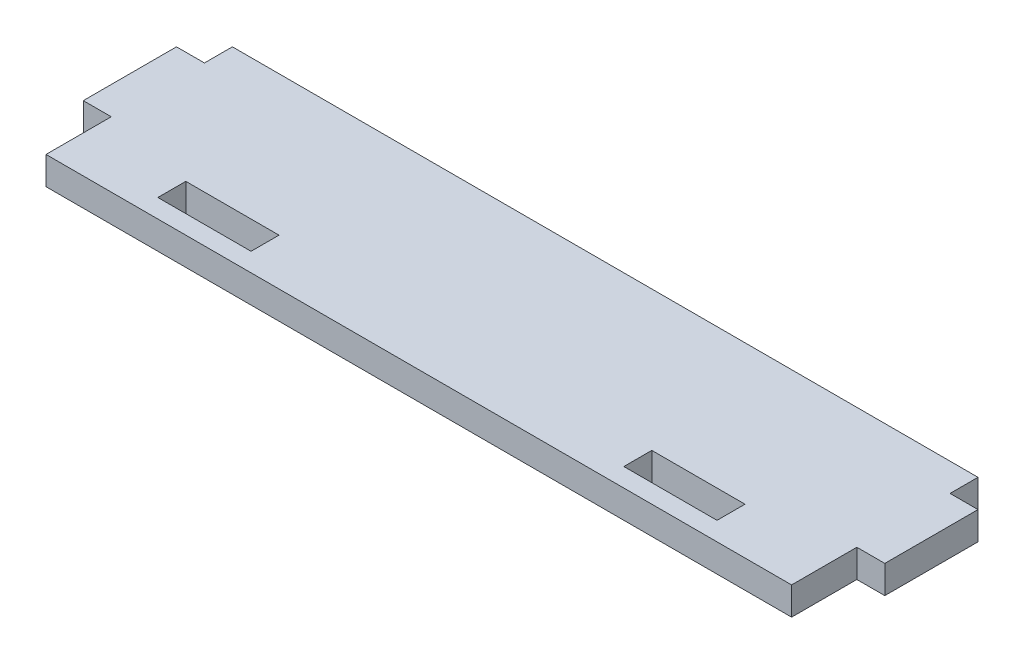
ISO-10303-21;
HEADER;
FILE_DESCRIPTION(('STEP AP214'),'2;1');
FILE_NAME('part.step','',(''),(''),'','','');
FILE_SCHEMA(('AUTOMOTIVE_DESIGN { 1 0 10303 214 1 1 1 1 }'));
ENDSEC;
DATA;
#1=APPLICATION_CONTEXT('core data for automotive mechanical design processes');
#2=APPLICATION_PROTOCOL_DEFINITION('international standard','automotive_design',2000,#1);
#3=PRODUCT_CONTEXT('',#1,'mechanical');
#4=PRODUCT('Part','Part','',(#3));
#5=PRODUCT_RELATED_PRODUCT_CATEGORY('part','',(#4));
#6=PRODUCT_DEFINITION_FORMATION('','',#4);
#7=PRODUCT_DEFINITION_CONTEXT('part definition',#1,'design');
#8=PRODUCT_DEFINITION('design','',#6,#7);
#9=PRODUCT_DEFINITION_SHAPE('','',#8);
#10=(LENGTH_UNIT() NAMED_UNIT(*) SI_UNIT(.MILLI.,.METRE.));
#11=(NAMED_UNIT(*) PLANE_ANGLE_UNIT() SI_UNIT($,.RADIAN.));
#12=(NAMED_UNIT(*) SI_UNIT($,.STERADIAN.) SOLID_ANGLE_UNIT());
#13=UNCERTAINTY_MEASURE_WITH_UNIT(LENGTH_MEASURE(1.E-05),#10,'distance_accuracy_value','');
#14=(GEOMETRIC_REPRESENTATION_CONTEXT(3) GLOBAL_UNCERTAINTY_ASSIGNED_CONTEXT((#13)) GLOBAL_UNIT_ASSIGNED_CONTEXT((#10,
#11,#12)) REPRESENTATION_CONTEXT('',''));
#15=CARTESIAN_POINT('',(0.,0.,0.));
#16=DIRECTION('',(0.,0.,1.));
#17=DIRECTION('',(1.,0.,0.));
#18=AXIS2_PLACEMENT_3D('',#15,#16,#17);
#19=CARTESIAN_POINT('',(0.,3.,0.));
#20=DIRECTION('',(0.,1.,0.));
#21=DIRECTION('',(0.,0.,1.));
#22=AXIS2_PLACEMENT_3D('',#19,#20,#21);
#23=PLANE('',#22);
#24=DIRECTION('',(0.,0.,1.));
#25=VECTOR('',#24,1.);
#26=CARTESIAN_POINT('',(0.,3.,0.));
#27=LINE('',#26,#25);
#28=CARTESIAN_POINT('',(0.,3.,-7.));
#29=VERTEX_POINT('',#28);
#30=CARTESIAN_POINT('',(0.,3.,0.));
#31=VERTEX_POINT('',#30);
#32=EDGE_CURVE('E237',#29,#31,#27,.T.);
#33=ORIENTED_EDGE('',*,*,#32,.T.);
#34=DIRECTION('',(1.,0.,0.));
#35=VECTOR('',#34,1.);
#36=CARTESIAN_POINT('',(0.,3.,0.));
#37=LINE('',#36,#35);
#38=CARTESIAN_POINT('',(80.,3.,0.));
#39=VERTEX_POINT('',#38);
#40=EDGE_CURVE('E240',#31,#39,#37,.T.);
#41=ORIENTED_EDGE('',*,*,#40,.T.);
#42=DIRECTION('',(0.,0.,-1.));
#43=VECTOR('',#42,1.);
#44=CARTESIAN_POINT('',(80.,3.,0.));
#45=LINE('',#44,#43);
#46=CARTESIAN_POINT('',(80.,3.,-7.));
#47=VERTEX_POINT('',#46);
#48=EDGE_CURVE('E243',#39,#47,#45,.T.);
#49=ORIENTED_EDGE('',*,*,#48,.T.);
#50=DIRECTION('',(1.,0.,0.));
#51=VECTOR('',#50,1.);
#52=CARTESIAN_POINT('',(80.,3.,-7.));
#53=LINE('',#52,#51);
#54=CARTESIAN_POINT('',(83.,3.,-7.));
#55=VERTEX_POINT('',#54);
#56=EDGE_CURVE('E245',#47,#55,#53,.T.);
#57=ORIENTED_EDGE('',*,*,#56,.T.);
#58=DIRECTION('',(0.,0.,-1.));
#59=VECTOR('',#58,1.);
#60=CARTESIAN_POINT('',(83.,3.,-17.));
#61=LINE('',#60,#59);
#62=CARTESIAN_POINT('',(83.,3.,-17.));
#63=VERTEX_POINT('',#62);
#64=EDGE_CURVE('E247',#55,#63,#61,.T.);
#65=ORIENTED_EDGE('',*,*,#64,.T.);
#66=DIRECTION('',(-1.,0.,0.));
#67=VECTOR('',#66,1.);
#68=CARTESIAN_POINT('',(80.,3.,-17.));
#69=LINE('',#68,#67);
#70=CARTESIAN_POINT('',(80.,3.,-17.));
#71=VERTEX_POINT('',#70);
#72=EDGE_CURVE('E249',#63,#71,#69,.T.);
#73=ORIENTED_EDGE('',*,*,#72,.T.);
#74=DIRECTION('',(0.,0.,-1.));
#75=VECTOR('',#74,1.);
#76=CARTESIAN_POINT('',(80.,3.,-17.));
#77=LINE('',#76,#75);
#78=CARTESIAN_POINT('',(80.,3.,-20.));
#79=VERTEX_POINT('',#78);
#80=EDGE_CURVE('E251',#71,#79,#77,.T.);
#81=ORIENTED_EDGE('',*,*,#80,.T.);
#82=DIRECTION('',(-1.,0.,0.));
#83=VECTOR('',#82,1.);
#84=CARTESIAN_POINT('',(0.,3.,-20.));
#85=LINE('',#84,#83);
#86=CARTESIAN_POINT('',(0.,3.,-20.));
#87=VERTEX_POINT('',#86);
#88=EDGE_CURVE('E253',#79,#87,#85,.T.);
#89=ORIENTED_EDGE('',*,*,#88,.T.);
#90=DIRECTION('',(0.,0.,1.));
#91=VECTOR('',#90,1.);
#92=CARTESIAN_POINT('',(0.,3.,-17.));
#93=LINE('',#92,#91);
#94=CARTESIAN_POINT('',(0.,3.,-17.));
#95=VERTEX_POINT('',#94);
#96=EDGE_CURVE('E255',#87,#95,#93,.T.);
#97=ORIENTED_EDGE('',*,*,#96,.T.);
#98=DIRECTION('',(-1.,0.,0.));
#99=VECTOR('',#98,1.);
#100=CARTESIAN_POINT('',(0.,3.,-17.));
#101=LINE('',#100,#99);
#102=CARTESIAN_POINT('',(-3.,3.,-17.));
#103=VERTEX_POINT('',#102);
#104=EDGE_CURVE('E257',#95,#103,#101,.T.);
#105=ORIENTED_EDGE('',*,*,#104,.T.);
#106=DIRECTION('',(0.,0.,1.));
#107=VECTOR('',#106,1.);
#108=CARTESIAN_POINT('',(-3.,3.,-17.));
#109=LINE('',#108,#107);
#110=CARTESIAN_POINT('',(-3.,3.,-7.));
#111=VERTEX_POINT('',#110);
#112=EDGE_CURVE('E259',#103,#111,#109,.T.);
#113=ORIENTED_EDGE('',*,*,#112,.T.);
#114=DIRECTION('',(1.,0.,0.));
#115=VECTOR('',#114,1.);
#116=CARTESIAN_POINT('',(0.,3.,-7.));
#117=LINE('',#116,#115);
#118=EDGE_CURVE('E261',#111,#29,#117,.T.);
#119=ORIENTED_EDGE('',*,*,#118,.T.);
#120=EDGE_LOOP('',(#33,#41,#49,#57,#65,#73,#81,#89,#97,#105,#113,#119));
#121=FACE_BOUND('',#120,.T.);
#122=DIRECTION('',(1.,0.,0.));
#123=VECTOR('',#122,1.);
#124=CARTESIAN_POINT('',(10.,3.,-2.));
#125=LINE('',#124,#123);
#126=CARTESIAN_POINT('',(10.,3.,-2.));
#127=VERTEX_POINT('',#126);
#128=CARTESIAN_POINT('',(20.,3.,-2.));
#129=VERTEX_POINT('',#128);
#130=EDGE_CURVE('E208',#127,#129,#125,.T.);
#131=ORIENTED_EDGE('',*,*,#130,.F.);
#132=DIRECTION('',(0.,0.,1.));
#133=VECTOR('',#132,1.);
#134=CARTESIAN_POINT('',(10.,3.,-5.));
#135=LINE('',#134,#133);
#136=CARTESIAN_POINT('',(10.,3.,-5.));
#137=VERTEX_POINT('',#136);
#138=EDGE_CURVE('E206',#137,#127,#135,.T.);
#139=ORIENTED_EDGE('',*,*,#138,.F.);
#140=DIRECTION('',(-1.,0.,0.));
#141=VECTOR('',#140,1.);
#142=CARTESIAN_POINT('',(10.,3.,-5.));
#143=LINE('',#142,#141);
#144=CARTESIAN_POINT('',(20.,3.,-5.));
#145=VERTEX_POINT('',#144);
#146=EDGE_CURVE('E214',#145,#137,#143,.T.);
#147=ORIENTED_EDGE('',*,*,#146,.F.);
#148=DIRECTION('',(0.,0.,-1.));
#149=VECTOR('',#148,1.);
#150=CARTESIAN_POINT('',(20.,3.,-5.));
#151=LINE('',#150,#149);
#152=EDGE_CURVE('E211',#129,#145,#151,.T.);
#153=ORIENTED_EDGE('',*,*,#152,.F.);
#154=EDGE_LOOP('',(#131,#139,#147,#153));
#155=FACE_BOUND('',#154,.T.);
#156=DIRECTION('',(1.,0.,0.));
#157=VECTOR('',#156,1.);
#158=CARTESIAN_POINT('',(60.,3.,-2.00000000000001));
#159=LINE('',#158,#157);
#160=CARTESIAN_POINT('',(60.,3.,-2.00000000000001));
#161=VERTEX_POINT('',#160);
#162=CARTESIAN_POINT('',(70.,3.,-2.00000000000001));
#163=VERTEX_POINT('',#162);
#164=EDGE_CURVE('E178',#161,#163,#159,.T.);
#165=ORIENTED_EDGE('',*,*,#164,.F.);
#166=DIRECTION('',(0.,0.,1.));
#167=VECTOR('',#166,1.);
#168=CARTESIAN_POINT('',(60.,3.,-5.00000000000001));
#169=LINE('',#168,#167);
#170=CARTESIAN_POINT('',(60.,3.,-5.00000000000001));
#171=VERTEX_POINT('',#170);
#172=EDGE_CURVE('E170',#171,#161,#169,.T.);
#173=ORIENTED_EDGE('',*,*,#172,.F.);
#174=DIRECTION('',(-1.,0.,0.));
#175=VECTOR('',#174,1.);
#176=CARTESIAN_POINT('',(60.,3.,-5.00000000000001));
#177=LINE('',#176,#175);
#178=CARTESIAN_POINT('',(70.,3.,-5.00000000000001));
#179=VERTEX_POINT('',#178);
#180=EDGE_CURVE('E192',#179,#171,#177,.T.);
#181=ORIENTED_EDGE('',*,*,#180,.F.);
#182=DIRECTION('',(0.,0.,-1.));
#183=VECTOR('',#182,1.);
#184=CARTESIAN_POINT('',(70.,3.,-5.00000000000001));
#185=LINE('',#184,#183);
#186=EDGE_CURVE('E190',#163,#179,#185,.T.);
#187=ORIENTED_EDGE('',*,*,#186,.F.);
#188=EDGE_LOOP('',(#165,#173,#181,#187));
#189=FACE_BOUND('',#188,.T.);
#190=ADVANCED_FACE('F33',(#121,#155,#189),#23,.T.);
#191=CARTESIAN_POINT('',(0.,0.,0.));
#192=DIRECTION('',(0.,1.,0.));
#193=DIRECTION('',(0.,0.,1.));
#194=AXIS2_PLACEMENT_3D('',#191,#192,#193);
#195=PLANE('',#194);
#196=DIRECTION('',(0.,0.,1.));
#197=VECTOR('',#196,1.);
#198=CARTESIAN_POINT('',(10.,0.,-5.));
#199=LINE('',#198,#197);
#200=CARTESIAN_POINT('',(10.,0.,-5.));
#201=VERTEX_POINT('',#200);
#202=CARTESIAN_POINT('',(10.,0.,-2.));
#203=VERTEX_POINT('',#202);
#204=EDGE_CURVE('E186',#201,#203,#199,.T.);
#205=ORIENTED_EDGE('',*,*,#204,.T.);
#206=DIRECTION('',(1.,0.,0.));
#207=VECTOR('',#206,1.);
#208=CARTESIAN_POINT('',(10.,0.,-2.));
#209=LINE('',#208,#207);
#210=CARTESIAN_POINT('',(20.,0.,-2.));
#211=VERTEX_POINT('',#210);
#212=EDGE_CURVE('E219',#203,#211,#209,.T.);
#213=ORIENTED_EDGE('',*,*,#212,.T.);
#214=DIRECTION('',(0.,0.,-1.));
#215=VECTOR('',#214,1.);
#216=CARTESIAN_POINT('',(20.,0.,-5.));
#217=LINE('',#216,#215);
#218=CARTESIAN_POINT('',(20.,0.,-5.));
#219=VERTEX_POINT('',#218);
#220=EDGE_CURVE('E222',#211,#219,#217,.T.);
#221=ORIENTED_EDGE('',*,*,#220,.T.);
#222=DIRECTION('',(-1.,0.,0.));
#223=VECTOR('',#222,1.);
#224=CARTESIAN_POINT('',(10.,0.,-5.));
#225=LINE('',#224,#223);
#226=EDGE_CURVE('E209',#219,#201,#225,.T.);
#227=ORIENTED_EDGE('',*,*,#226,.T.);
#228=EDGE_LOOP('',(#205,#213,#221,#227));
#229=FACE_BOUND('',#228,.T.);
#230=DIRECTION('',(0.,0.,1.));
#231=VECTOR('',#230,1.);
#232=CARTESIAN_POINT('',(0.,0.,0.));
#233=LINE('',#232,#231);
#234=CARTESIAN_POINT('',(0.,0.,-7.));
#235=VERTEX_POINT('',#234);
#236=CARTESIAN_POINT('',(0.,0.,0.));
#237=VERTEX_POINT('',#236);
#238=EDGE_CURVE('E236',#235,#237,#233,.T.);
#239=ORIENTED_EDGE('',*,*,#238,.F.);
#240=DIRECTION('',(1.,0.,0.));
#241=VECTOR('',#240,1.);
#242=CARTESIAN_POINT('',(0.,0.,-7.));
#243=LINE('',#242,#241);
#244=CARTESIAN_POINT('',(-3.,0.,-7.));
#245=VERTEX_POINT('',#244);
#246=EDGE_CURVE('E241',#245,#235,#243,.T.);
#247=ORIENTED_EDGE('',*,*,#246,.F.);
#248=DIRECTION('',(0.,0.,1.));
#249=VECTOR('',#248,1.);
#250=CARTESIAN_POINT('',(-3.,0.,-17.));
#251=LINE('',#250,#249);
#252=CARTESIAN_POINT('',(-3.,0.,-17.));
#253=VERTEX_POINT('',#252);
#254=EDGE_CURVE('E284',#253,#245,#251,.T.);
#255=ORIENTED_EDGE('',*,*,#254,.F.);
#256=DIRECTION('',(-1.,0.,0.));
#257=VECTOR('',#256,1.);
#258=CARTESIAN_POINT('',(0.,0.,-17.));
#259=LINE('',#258,#257);
#260=CARTESIAN_POINT('',(0.,0.,-17.));
#261=VERTEX_POINT('',#260);
#262=EDGE_CURVE('E282',#261,#253,#259,.T.);
#263=ORIENTED_EDGE('',*,*,#262,.F.);
#264=DIRECTION('',(0.,0.,1.));
#265=VECTOR('',#264,1.);
#266=CARTESIAN_POINT('',(0.,0.,-17.));
#267=LINE('',#266,#265);
#268=CARTESIAN_POINT('',(0.,0.,-20.));
#269=VERTEX_POINT('',#268);
#270=EDGE_CURVE('E280',#269,#261,#267,.T.);
#271=ORIENTED_EDGE('',*,*,#270,.F.);
#272=DIRECTION('',(-1.,0.,0.));
#273=VECTOR('',#272,1.);
#274=CARTESIAN_POINT('',(0.,0.,-20.));
#275=LINE('',#274,#273);
#276=CARTESIAN_POINT('',(80.,0.,-20.));
#277=VERTEX_POINT('',#276);
#278=EDGE_CURVE('E278',#277,#269,#275,.T.);
#279=ORIENTED_EDGE('',*,*,#278,.F.);
#280=DIRECTION('',(0.,0.,-1.));
#281=VECTOR('',#280,1.);
#282=CARTESIAN_POINT('',(80.,0.,-17.));
#283=LINE('',#282,#281);
#284=CARTESIAN_POINT('',(80.,0.,-17.));
#285=VERTEX_POINT('',#284);
#286=EDGE_CURVE('E276',#285,#277,#283,.T.);
#287=ORIENTED_EDGE('',*,*,#286,.F.);
#288=DIRECTION('',(-1.,0.,0.));
#289=VECTOR('',#288,1.);
#290=CARTESIAN_POINT('',(80.,0.,-17.));
#291=LINE('',#290,#289);
#292=CARTESIAN_POINT('',(83.,0.,-17.));
#293=VERTEX_POINT('',#292);
#294=EDGE_CURVE('E274',#293,#285,#291,.T.);
#295=ORIENTED_EDGE('',*,*,#294,.F.);
#296=DIRECTION('',(0.,0.,-1.));
#297=VECTOR('',#296,1.);
#298=CARTESIAN_POINT('',(83.,0.,-17.));
#299=LINE('',#298,#297);
#300=CARTESIAN_POINT('',(83.,0.,-7.));
#301=VERTEX_POINT('',#300);
#302=EDGE_CURVE('E272',#301,#293,#299,.T.);
#303=ORIENTED_EDGE('',*,*,#302,.F.);
#304=DIRECTION('',(1.,0.,0.));
#305=VECTOR('',#304,1.);
#306=CARTESIAN_POINT('',(80.,0.,-7.));
#307=LINE('',#306,#305);
#308=CARTESIAN_POINT('',(80.,0.,-7.));
#309=VERTEX_POINT('',#308);
#310=EDGE_CURVE('E270',#309,#301,#307,.T.);
#311=ORIENTED_EDGE('',*,*,#310,.F.);
#312=DIRECTION('',(0.,0.,-1.));
#313=VECTOR('',#312,1.);
#314=CARTESIAN_POINT('',(80.,0.,0.));
#315=LINE('',#314,#313);
#316=CARTESIAN_POINT('',(80.,0.,0.));
#317=VERTEX_POINT('',#316);
#318=EDGE_CURVE('E268',#317,#309,#315,.T.);
#319=ORIENTED_EDGE('',*,*,#318,.F.);
#320=DIRECTION('',(1.,0.,0.));
#321=VECTOR('',#320,1.);
#322=CARTESIAN_POINT('',(0.,0.,0.));
#323=LINE('',#322,#321);
#324=EDGE_CURVE('E266',#237,#317,#323,.T.);
#325=ORIENTED_EDGE('',*,*,#324,.F.);
#326=EDGE_LOOP('',(#239,#247,#255,#263,#271,#279,#287,#295,#303,#311,#319,#325));
#327=FACE_BOUND('',#326,.T.);
#328=DIRECTION('',(0.,0.,1.));
#329=VECTOR('',#328,1.);
#330=CARTESIAN_POINT('',(60.,0.,-5.00000000000001));
#331=LINE('',#330,#329);
#332=CARTESIAN_POINT('',(60.,0.,-5.00000000000001));
#333=VERTEX_POINT('',#332);
#334=CARTESIAN_POINT('',(60.,0.,-2.00000000000001));
#335=VERTEX_POINT('',#334);
#336=EDGE_CURVE('E56',#333,#335,#331,.T.);
#337=ORIENTED_EDGE('',*,*,#336,.T.);
#338=DIRECTION('',(1.,0.,0.));
#339=VECTOR('',#338,1.);
#340=CARTESIAN_POINT('',(60.,0.,-2.00000000000001));
#341=LINE('',#340,#339);
#342=CARTESIAN_POINT('',(70.,0.,-2.00000000000001));
#343=VERTEX_POINT('',#342);
#344=EDGE_CURVE('E185',#335,#343,#341,.T.);
#345=ORIENTED_EDGE('',*,*,#344,.T.);
#346=DIRECTION('',(0.,0.,-1.));
#347=VECTOR('',#346,1.);
#348=CARTESIAN_POINT('',(70.,0.,-5.00000000000001));
#349=LINE('',#348,#347);
#350=CARTESIAN_POINT('',(70.,0.,-5.00000000000001));
#351=VERTEX_POINT('',#350);
#352=EDGE_CURVE('E198',#343,#351,#349,.T.);
#353=ORIENTED_EDGE('',*,*,#352,.T.);
#354=DIRECTION('',(-1.,0.,0.));
#355=VECTOR('',#354,1.);
#356=CARTESIAN_POINT('',(60.,0.,-5.00000000000001));
#357=LINE('',#356,#355);
#358=EDGE_CURVE('E179',#351,#333,#357,.T.);
#359=ORIENTED_EDGE('',*,*,#358,.T.);
#360=EDGE_LOOP('',(#337,#345,#353,#359));
#361=FACE_BOUND('',#360,.T.);
#362=ADVANCED_FACE('F326',(#229,#327,#361),#195,.F.);
#363=CARTESIAN_POINT('',(0.,3.,0.));
#364=DIRECTION('',(1.,0.,0.));
#365=DIRECTION('',(0.,0.,-1.));
#366=AXIS2_PLACEMENT_3D('',#363,#364,#365);
#367=PLANE('',#366);
#368=ORIENTED_EDGE('',*,*,#238,.T.);
#369=DIRECTION('',(0.,-1.,0.));
#370=VECTOR('',#369,1.);
#371=CARTESIAN_POINT('',(0.,3.,0.));
#372=LINE('',#371,#370);
#373=EDGE_CURVE('E11',#31,#237,#372,.T.);
#374=ORIENTED_EDGE('',*,*,#373,.F.);
#375=ORIENTED_EDGE('',*,*,#32,.F.);
#376=DIRECTION('',(0.,-1.,0.));
#377=VECTOR('',#376,1.);
#378=CARTESIAN_POINT('',(0.,3.,-7.));
#379=LINE('',#378,#377);
#380=EDGE_CURVE('E263',#29,#235,#379,.T.);
#381=ORIENTED_EDGE('',*,*,#380,.T.);
#382=EDGE_LOOP('',(#368,#374,#375,#381));
#383=FACE_BOUND('',#382,.T.);
#384=ADVANCED_FACE('F35',(#383),#367,.F.);
#385=CARTESIAN_POINT('',(0.,3.,0.));
#386=DIRECTION('',(0.,0.,-1.));
#387=DIRECTION('',(-1.,0.,0.));
#388=AXIS2_PLACEMENT_3D('',#385,#386,#387);
#389=PLANE('',#388);
#390=ORIENTED_EDGE('',*,*,#324,.T.);
#391=DIRECTION('',(0.,-1.,0.));
#392=VECTOR('',#391,1.);
#393=CARTESIAN_POINT('',(80.,3.,0.));
#394=LINE('',#393,#392);
#395=EDGE_CURVE('E41',#39,#317,#394,.T.);
#396=ORIENTED_EDGE('',*,*,#395,.F.);
#397=ORIENTED_EDGE('',*,*,#40,.F.);
#398=ORIENTED_EDGE('',*,*,#373,.T.);
#399=EDGE_LOOP('',(#390,#396,#397,#398));
#400=FACE_BOUND('',#399,.T.);
#401=ADVANCED_FACE('F344',(#400),#389,.F.);
#402=CARTESIAN_POINT('',(80.,3.,0.));
#403=DIRECTION('',(-1.,0.,0.));
#404=DIRECTION('',(0.,0.,1.));
#405=AXIS2_PLACEMENT_3D('',#402,#403,#404);
#406=PLANE('',#405);
#407=ORIENTED_EDGE('',*,*,#318,.T.);
#408=DIRECTION('',(0.,-1.,0.));
#409=VECTOR('',#408,1.);
#410=CARTESIAN_POINT('',(80.,3.,-7.));
#411=LINE('',#410,#409);
#412=EDGE_CURVE('E313',#47,#309,#411,.T.);
#413=ORIENTED_EDGE('',*,*,#412,.F.);
#414=ORIENTED_EDGE('',*,*,#48,.F.);
#415=ORIENTED_EDGE('',*,*,#395,.T.);
#416=EDGE_LOOP('',(#407,#413,#414,#415));
#417=FACE_BOUND('',#416,.T.);
#418=ADVANCED_FACE('F320',(#417),#406,.F.);
#419=CARTESIAN_POINT('',(80.,3.,-7.));
#420=DIRECTION('',(0.,0.,-1.));
#421=DIRECTION('',(-1.,0.,0.));
#422=AXIS2_PLACEMENT_3D('',#419,#420,#421);
#423=PLANE('',#422);
#424=ORIENTED_EDGE('',*,*,#310,.T.);
#425=DIRECTION('',(0.,-1.,0.));
#426=VECTOR('',#425,1.);
#427=CARTESIAN_POINT('',(83.,3.,-7.));
#428=LINE('',#427,#426);
#429=EDGE_CURVE('E310',#55,#301,#428,.T.);
#430=ORIENTED_EDGE('',*,*,#429,.F.);
#431=ORIENTED_EDGE('',*,*,#56,.F.);
#432=ORIENTED_EDGE('',*,*,#412,.T.);
#433=EDGE_LOOP('',(#424,#430,#431,#432));
#434=FACE_BOUND('',#433,.T.);
#435=ADVANCED_FACE('F332',(#434),#423,.F.);
#436=CARTESIAN_POINT('',(83.,3.,-17.));
#437=DIRECTION('',(-1.,0.,0.));
#438=DIRECTION('',(0.,0.,1.));
#439=AXIS2_PLACEMENT_3D('',#436,#437,#438);
#440=PLANE('',#439);
#441=ORIENTED_EDGE('',*,*,#302,.T.);
#442=DIRECTION('',(0.,-1.,0.));
#443=VECTOR('',#442,1.);
#444=CARTESIAN_POINT('',(83.,3.,-17.));
#445=LINE('',#444,#443);
#446=EDGE_CURVE('E307',#63,#293,#445,.T.);
#447=ORIENTED_EDGE('',*,*,#446,.F.);
#448=ORIENTED_EDGE('',*,*,#64,.F.);
#449=ORIENTED_EDGE('',*,*,#429,.T.);
#450=EDGE_LOOP('',(#441,#447,#448,#449));
#451=FACE_BOUND('',#450,.T.);
#452=ADVANCED_FACE('F336',(#451),#440,.F.);
#453=CARTESIAN_POINT('',(80.,3.,-17.));
#454=DIRECTION('',(0.,0.,1.));
#455=DIRECTION('',(1.,0.,0.));
#456=AXIS2_PLACEMENT_3D('',#453,#454,#455);
#457=PLANE('',#456);
#458=ORIENTED_EDGE('',*,*,#294,.T.);
#459=DIRECTION('',(0.,-1.,0.));
#460=VECTOR('',#459,1.);
#461=CARTESIAN_POINT('',(80.,3.,-17.));
#462=LINE('',#461,#460);
#463=EDGE_CURVE('E304',#71,#285,#462,.T.);
#464=ORIENTED_EDGE('',*,*,#463,.F.);
#465=ORIENTED_EDGE('',*,*,#72,.F.);
#466=ORIENTED_EDGE('',*,*,#446,.T.);
#467=EDGE_LOOP('',(#458,#464,#465,#466));
#468=FACE_BOUND('',#467,.T.);
#469=ADVANCED_FACE('F377',(#468),#457,.F.);
#470=CARTESIAN_POINT('',(80.,3.,-17.));
#471=DIRECTION('',(-1.,0.,0.));
#472=DIRECTION('',(0.,0.,1.));
#473=AXIS2_PLACEMENT_3D('',#470,#471,#472);
#474=PLANE('',#473);
#475=ORIENTED_EDGE('',*,*,#286,.T.);
#476=DIRECTION('',(0.,-1.,0.));
#477=VECTOR('',#476,1.);
#478=CARTESIAN_POINT('',(80.,3.,-20.));
#479=LINE('',#478,#477);
#480=EDGE_CURVE('E301',#79,#277,#479,.T.);
#481=ORIENTED_EDGE('',*,*,#480,.F.);
#482=ORIENTED_EDGE('',*,*,#80,.F.);
#483=ORIENTED_EDGE('',*,*,#463,.T.);
#484=EDGE_LOOP('',(#475,#481,#482,#483));
#485=FACE_BOUND('',#484,.T.);
#486=ADVANCED_FACE('F375',(#485),#474,.F.);
#487=CARTESIAN_POINT('',(0.,3.,-20.));
#488=DIRECTION('',(0.,0.,1.));
#489=DIRECTION('',(1.,0.,0.));
#490=AXIS2_PLACEMENT_3D('',#487,#488,#489);
#491=PLANE('',#490);
#492=ORIENTED_EDGE('',*,*,#278,.T.);
#493=DIRECTION('',(0.,-1.,0.));
#494=VECTOR('',#493,1.);
#495=CARTESIAN_POINT('',(0.,3.,-20.));
#496=LINE('',#495,#494);
#497=EDGE_CURVE('E298',#87,#269,#496,.T.);
#498=ORIENTED_EDGE('',*,*,#497,.F.);
#499=ORIENTED_EDGE('',*,*,#88,.F.);
#500=ORIENTED_EDGE('',*,*,#480,.T.);
#501=EDGE_LOOP('',(#492,#498,#499,#500));
#502=FACE_BOUND('',#501,.T.);
#503=ADVANCED_FACE('F371',(#502),#491,.F.);
#504=CARTESIAN_POINT('',(0.,3.,-17.));
#505=DIRECTION('',(1.,0.,0.));
#506=DIRECTION('',(0.,0.,-1.));
#507=AXIS2_PLACEMENT_3D('',#504,#505,#506);
#508=PLANE('',#507);
#509=ORIENTED_EDGE('',*,*,#270,.T.);
#510=DIRECTION('',(0.,-1.,0.));
#511=VECTOR('',#510,1.);
#512=CARTESIAN_POINT('',(0.,3.,-17.));
#513=LINE('',#512,#511);
#514=EDGE_CURVE('E295',#95,#261,#513,.T.);
#515=ORIENTED_EDGE('',*,*,#514,.F.);
#516=ORIENTED_EDGE('',*,*,#96,.F.);
#517=ORIENTED_EDGE('',*,*,#497,.T.);
#518=EDGE_LOOP('',(#509,#515,#516,#517));
#519=FACE_BOUND('',#518,.T.);
#520=ADVANCED_FACE('F366',(#519),#508,.F.);
#521=CARTESIAN_POINT('',(0.,3.,-17.));
#522=DIRECTION('',(0.,0.,1.));
#523=DIRECTION('',(1.,0.,0.));
#524=AXIS2_PLACEMENT_3D('',#521,#522,#523);
#525=PLANE('',#524);
#526=ORIENTED_EDGE('',*,*,#262,.T.);
#527=DIRECTION('',(0.,-1.,0.));
#528=VECTOR('',#527,1.);
#529=CARTESIAN_POINT('',(-3.,3.,-17.));
#530=LINE('',#529,#528);
#531=EDGE_CURVE('E292',#103,#253,#530,.T.);
#532=ORIENTED_EDGE('',*,*,#531,.F.);
#533=ORIENTED_EDGE('',*,*,#104,.F.);
#534=ORIENTED_EDGE('',*,*,#514,.T.);
#535=EDGE_LOOP('',(#526,#532,#533,#534));
#536=FACE_BOUND('',#535,.T.);
#537=ADVANCED_FACE('F360',(#536),#525,.F.);
#538=CARTESIAN_POINT('',(-3.,3.,-17.));
#539=DIRECTION('',(1.,0.,0.));
#540=DIRECTION('',(0.,0.,-1.));
#541=AXIS2_PLACEMENT_3D('',#538,#539,#540);
#542=PLANE('',#541);
#543=ORIENTED_EDGE('',*,*,#254,.T.);
#544=DIRECTION('',(0.,-1.,0.));
#545=VECTOR('',#544,1.);
#546=CARTESIAN_POINT('',(-3.,3.,-7.));
#547=LINE('',#546,#545);
#548=EDGE_CURVE('E289',#111,#245,#547,.T.);
#549=ORIENTED_EDGE('',*,*,#548,.F.);
#550=ORIENTED_EDGE('',*,*,#112,.F.);
#551=ORIENTED_EDGE('',*,*,#531,.T.);
#552=EDGE_LOOP('',(#543,#549,#550,#551));
#553=FACE_BOUND('',#552,.T.);
#554=ADVANCED_FACE('F356',(#553),#542,.F.);
#555=CARTESIAN_POINT('',(0.,3.,-7.));
#556=DIRECTION('',(0.,0.,-1.));
#557=DIRECTION('',(-1.,0.,0.));
#558=AXIS2_PLACEMENT_3D('',#555,#556,#557);
#559=PLANE('',#558);
#560=ORIENTED_EDGE('',*,*,#246,.T.);
#561=ORIENTED_EDGE('',*,*,#380,.F.);
#562=ORIENTED_EDGE('',*,*,#118,.F.);
#563=ORIENTED_EDGE('',*,*,#548,.T.);
#564=EDGE_LOOP('',(#560,#561,#562,#563));
#565=FACE_BOUND('',#564,.T.);
#566=ADVANCED_FACE('F351',(#565),#559,.F.);
#567=CARTESIAN_POINT('',(10.,3.,-5.));
#568=DIRECTION('',(1.,0.,0.));
#569=DIRECTION('',(0.,0.,-1.));
#570=AXIS2_PLACEMENT_3D('',#567,#568,#569);
#571=PLANE('',#570);
#572=ORIENTED_EDGE('',*,*,#204,.F.);
#573=DIRECTION('',(0.,-1.,0.));
#574=VECTOR('',#573,1.);
#575=CARTESIAN_POINT('',(10.,3.,-5.));
#576=LINE('',#575,#574);
#577=EDGE_CURVE('E216',#137,#201,#576,.T.);
#578=ORIENTED_EDGE('',*,*,#577,.F.);
#579=ORIENTED_EDGE('',*,*,#138,.T.);
#580=DIRECTION('',(0.,-1.,0.));
#581=VECTOR('',#580,1.);
#582=CARTESIAN_POINT('',(10.,3.,-2.));
#583=LINE('',#582,#581);
#584=EDGE_CURVE('E233',#127,#203,#583,.T.);
#585=ORIENTED_EDGE('',*,*,#584,.T.);
#586=EDGE_LOOP('',(#572,#578,#579,#585));
#587=FACE_BOUND('',#586,.T.);
#588=ADVANCED_FACE('F394',(#587),#571,.T.);
#589=CARTESIAN_POINT('',(10.,3.,-2.));
#590=DIRECTION('',(0.,0.,-1.));
#591=DIRECTION('',(-1.,0.,0.));
#592=AXIS2_PLACEMENT_3D('',#589,#590,#591);
#593=PLANE('',#592);
#594=ORIENTED_EDGE('',*,*,#212,.F.);
#595=ORIENTED_EDGE('',*,*,#584,.F.);
#596=ORIENTED_EDGE('',*,*,#130,.T.);
#597=DIRECTION('',(0.,-1.,0.));
#598=VECTOR('',#597,1.);
#599=CARTESIAN_POINT('',(20.,3.,-2.));
#600=LINE('',#599,#598);
#601=EDGE_CURVE('E231',#129,#211,#600,.T.);
#602=ORIENTED_EDGE('',*,*,#601,.T.);
#603=EDGE_LOOP('',(#594,#595,#596,#602));
#604=FACE_BOUND('',#603,.T.);
#605=ADVANCED_FACE('F432',(#604),#593,.T.);
#606=CARTESIAN_POINT('',(20.,3.,-5.));
#607=DIRECTION('',(-1.,0.,0.));
#608=DIRECTION('',(0.,0.,1.));
#609=AXIS2_PLACEMENT_3D('',#606,#607,#608);
#610=PLANE('',#609);
#611=ORIENTED_EDGE('',*,*,#220,.F.);
#612=ORIENTED_EDGE('',*,*,#601,.F.);
#613=ORIENTED_EDGE('',*,*,#152,.T.);
#614=DIRECTION('',(0.,-1.,0.));
#615=VECTOR('',#614,1.);
#616=CARTESIAN_POINT('',(20.,3.,-5.));
#617=LINE('',#616,#615);
#618=EDGE_CURVE('E229',#145,#219,#617,.T.);
#619=ORIENTED_EDGE('',*,*,#618,.T.);
#620=EDGE_LOOP('',(#611,#612,#613,#619));
#621=FACE_BOUND('',#620,.T.);
#622=ADVANCED_FACE('F439',(#621),#610,.T.);
#623=CARTESIAN_POINT('',(10.,3.,-5.));
#624=DIRECTION('',(0.,0.,1.));
#625=DIRECTION('',(1.,0.,0.));
#626=AXIS2_PLACEMENT_3D('',#623,#624,#625);
#627=PLANE('',#626);
#628=ORIENTED_EDGE('',*,*,#226,.F.);
#629=ORIENTED_EDGE('',*,*,#618,.F.);
#630=ORIENTED_EDGE('',*,*,#146,.T.);
#631=ORIENTED_EDGE('',*,*,#577,.T.);
#632=EDGE_LOOP('',(#628,#629,#630,#631));
#633=FACE_BOUND('',#632,.T.);
#634=ADVANCED_FACE('F446',(#633),#627,.T.);
#635=CARTESIAN_POINT('',(60.,3.,-5.00000000000001));
#636=DIRECTION('',(1.,0.,0.));
#637=DIRECTION('',(0.,0.,-1.));
#638=AXIS2_PLACEMENT_3D('',#635,#636,#637);
#639=PLANE('',#638);
#640=ORIENTED_EDGE('',*,*,#336,.F.);
#641=DIRECTION('',(0.,-1.,0.));
#642=VECTOR('',#641,1.);
#643=CARTESIAN_POINT('',(60.,3.,-5.00000000000001));
#644=LINE('',#643,#642);
#645=EDGE_CURVE('E174',#171,#333,#644,.T.);
#646=ORIENTED_EDGE('',*,*,#645,.F.);
#647=ORIENTED_EDGE('',*,*,#172,.T.);
#648=DIRECTION('',(0.,-1.,0.));
#649=VECTOR('',#648,1.);
#650=CARTESIAN_POINT('',(60.,3.,-2.00000000000001));
#651=LINE('',#650,#649);
#652=EDGE_CURVE('E173',#161,#335,#651,.T.);
#653=ORIENTED_EDGE('',*,*,#652,.T.);
#654=EDGE_LOOP('',(#640,#646,#647,#653));
#655=FACE_BOUND('',#654,.T.);
#656=ADVANCED_FACE('F172',(#655),#639,.T.);
#657=CARTESIAN_POINT('',(60.,3.,-2.00000000000001));
#658=DIRECTION('',(0.,0.,-1.));
#659=DIRECTION('',(-1.,0.,0.));
#660=AXIS2_PLACEMENT_3D('',#657,#658,#659);
#661=PLANE('',#660);
#662=ORIENTED_EDGE('',*,*,#344,.F.);
#663=ORIENTED_EDGE('',*,*,#652,.F.);
#664=ORIENTED_EDGE('',*,*,#164,.T.);
#665=DIRECTION('',(0.,-1.,0.));
#666=VECTOR('',#665,1.);
#667=CARTESIAN_POINT('',(70.,3.,-2.00000000000001));
#668=LINE('',#667,#666);
#669=EDGE_CURVE('E187',#163,#343,#668,.T.);
#670=ORIENTED_EDGE('',*,*,#669,.T.);
#671=EDGE_LOOP('',(#662,#663,#664,#670));
#672=FACE_BOUND('',#671,.T.);
#673=ADVANCED_FACE('F182',(#672),#661,.T.);
#674=CARTESIAN_POINT('',(70.,3.,-5.00000000000001));
#675=DIRECTION('',(-1.,0.,0.));
#676=DIRECTION('',(0.,0.,1.));
#677=AXIS2_PLACEMENT_3D('',#674,#675,#676);
#678=PLANE('',#677);
#679=ORIENTED_EDGE('',*,*,#352,.F.);
#680=ORIENTED_EDGE('',*,*,#669,.F.);
#681=ORIENTED_EDGE('',*,*,#186,.T.);
#682=DIRECTION('',(0.,-1.,0.));
#683=VECTOR('',#682,1.);
#684=CARTESIAN_POINT('',(70.,3.,-5.00000000000001));
#685=LINE('',#684,#683);
#686=EDGE_CURVE('E48',#179,#351,#685,.T.);
#687=ORIENTED_EDGE('',*,*,#686,.T.);
#688=EDGE_LOOP('',(#679,#680,#681,#687));
#689=FACE_BOUND('',#688,.T.);
#690=ADVANCED_FACE('F467',(#689),#678,.T.);
#691=CARTESIAN_POINT('',(60.,3.,-5.00000000000001));
#692=DIRECTION('',(0.,0.,1.));
#693=DIRECTION('',(1.,0.,0.));
#694=AXIS2_PLACEMENT_3D('',#691,#692,#693);
#695=PLANE('',#694);
#696=ORIENTED_EDGE('',*,*,#358,.F.);
#697=ORIENTED_EDGE('',*,*,#686,.F.);
#698=ORIENTED_EDGE('',*,*,#180,.T.);
#699=ORIENTED_EDGE('',*,*,#645,.T.);
#700=EDGE_LOOP('',(#696,#697,#698,#699));
#701=FACE_BOUND('',#700,.T.);
#702=ADVANCED_FACE('F474',(#701),#695,.T.);
#703=CLOSED_SHELL('',(#190,#362,#384,#401,#418,#435,#452,#469,#486,#503,#520,#537,#554,#566,
#588,#605,#622,#634,#656,#673,#690,#702));
#704=MANIFOLD_SOLID_BREP('B2',#703);
#705=ADVANCED_BREP_SHAPE_REPRESENTATION('',(#18,#704),#14);
#706=SHAPE_DEFINITION_REPRESENTATION(#9,#705);
ENDSEC;
END-ISO-10303-21;
